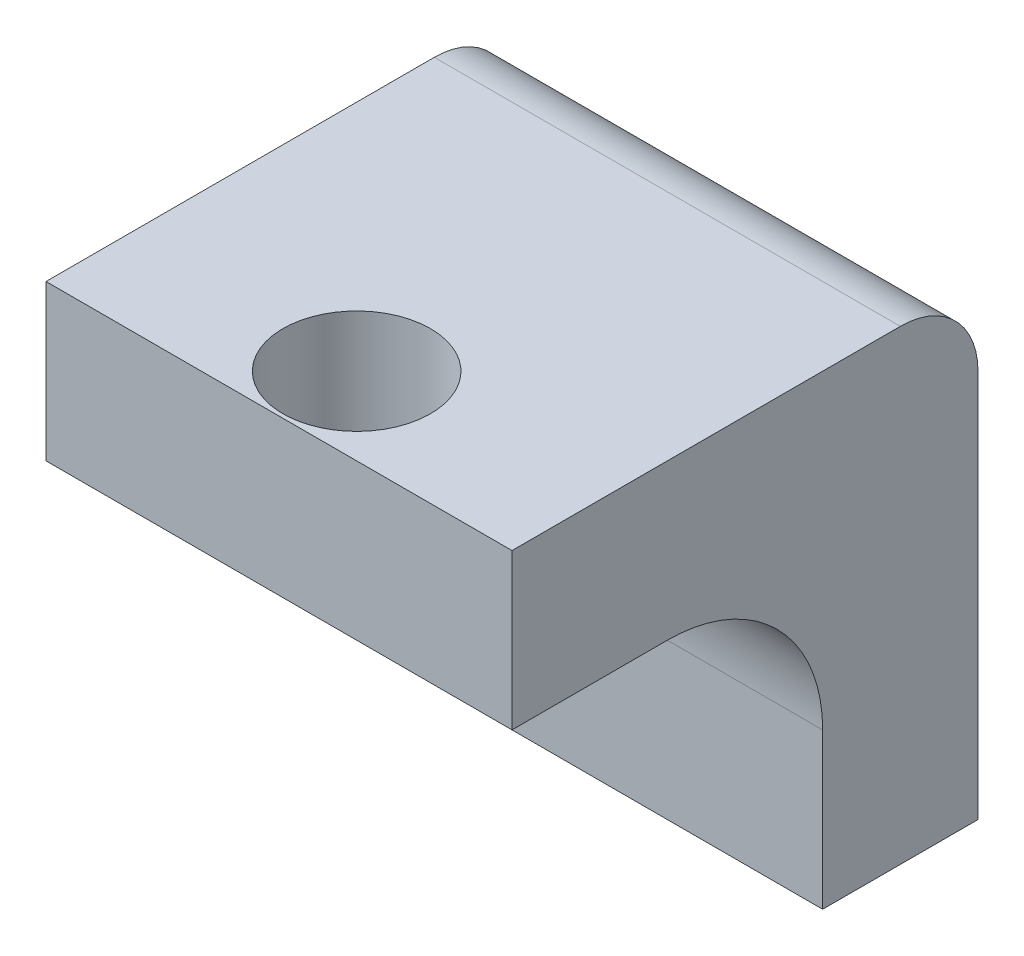
ISO-10303-21;
HEADER;
FILE_DESCRIPTION(('STEP AP214'),'2;1');
FILE_NAME('part.step','',(''),(''),'','','');
FILE_SCHEMA(('AUTOMOTIVE_DESIGN { 1 0 10303 214 1 1 1 1 }'));
ENDSEC;
DATA;
#1=APPLICATION_CONTEXT('core data for automotive mechanical design processes');
#2=APPLICATION_PROTOCOL_DEFINITION('international standard','automotive_design',2000,#1);
#3=PRODUCT_CONTEXT('',#1,'mechanical');
#4=PRODUCT('Part','Part','',(#3));
#5=PRODUCT_RELATED_PRODUCT_CATEGORY('part','',(#4));
#6=PRODUCT_DEFINITION_FORMATION('','',#4);
#7=PRODUCT_DEFINITION_CONTEXT('part definition',#1,'design');
#8=PRODUCT_DEFINITION('design','',#6,#7);
#9=PRODUCT_DEFINITION_SHAPE('','',#8);
#10=(LENGTH_UNIT() NAMED_UNIT(*) SI_UNIT(.MILLI.,.METRE.));
#11=(NAMED_UNIT(*) PLANE_ANGLE_UNIT() SI_UNIT($,.RADIAN.));
#12=(NAMED_UNIT(*) SI_UNIT($,.STERADIAN.) SOLID_ANGLE_UNIT());
#13=UNCERTAINTY_MEASURE_WITH_UNIT(LENGTH_MEASURE(1.E-05),#10,'distance_accuracy_value','');
#14=(GEOMETRIC_REPRESENTATION_CONTEXT(3) GLOBAL_UNCERTAINTY_ASSIGNED_CONTEXT((#13)) GLOBAL_UNIT_ASSIGNED_CONTEXT((#10,
#11,#12)) REPRESENTATION_CONTEXT('',''));
#15=CARTESIAN_POINT('',(0.,0.,0.));
#16=DIRECTION('',(0.,0.,1.));
#17=DIRECTION('',(1.,0.,0.));
#18=AXIS2_PLACEMENT_3D('',#15,#16,#17);
#19=CARTESIAN_POINT('',(0.,0.,10.));
#20=DIRECTION('',(1.,0.,0.));
#21=DIRECTION('',(0.,0.,-1.));
#22=AXIS2_PLACEMENT_3D('',#19,#20,#21);
#23=PLANE('',#22);
#24=DIRECTION('',(0.,0.,-1.));
#25=VECTOR('',#24,1.);
#26=CARTESIAN_POINT('',(0.,30.,10.));
#27=LINE('',#26,#25);
#28=CARTESIAN_POINT('',(0.,30.,30.));
#29=VERTEX_POINT('',#28);
#30=CARTESIAN_POINT('',(0.,30.,5.));
#31=VERTEX_POINT('',#30);
#32=EDGE_CURVE('E121',#29,#31,#27,.T.);
#33=ORIENTED_EDGE('',*,*,#32,.T.);
#34=CARTESIAN_POINT('',(0.,25.,5.));
#35=DIRECTION('',(1.,0.,0.));
#36=DIRECTION('',(0.,0.,-1.));
#37=AXIS2_PLACEMENT_3D('',#34,#35,#36);
#38=CIRCLE('',#37,5.);
#39=CARTESIAN_POINT('',(0.,25.,0.));
#40=VERTEX_POINT('',#39);
#41=EDGE_CURVE('E68',#31,#40,#38,.F.);
#42=ORIENTED_EDGE('',*,*,#41,.T.);
#43=DIRECTION('',(0.,-1.,0.));
#44=VECTOR('',#43,1.);
#45=CARTESIAN_POINT('',(0.,0.,0.));
#46=LINE('',#45,#44);
#47=CARTESIAN_POINT('',(0.,0.,0.));
#48=VERTEX_POINT('',#47);
#49=EDGE_CURVE('E128',#40,#48,#46,.T.);
#50=ORIENTED_EDGE('',*,*,#49,.T.);
#51=DIRECTION('',(0.,0.,-1.));
#52=VECTOR('',#51,1.);
#53=CARTESIAN_POINT('',(0.,0.,10.));
#54=LINE('',#53,#52);
#55=CARTESIAN_POINT('',(0.,0.,10.));
#56=VERTEX_POINT('',#55);
#57=EDGE_CURVE('E161',#56,#48,#54,.T.);
#58=ORIENTED_EDGE('',*,*,#57,.F.);
#59=DIRECTION('',(0.,-1.,0.));
#60=VECTOR('',#59,1.);
#61=CARTESIAN_POINT('',(0.,0.,10.));
#62=LINE('',#61,#60);
#63=CARTESIAN_POINT('',(0.,10.,10.));
#64=VERTEX_POINT('',#63);
#65=EDGE_CURVE('E146',#64,#56,#62,.T.);
#66=ORIENTED_EDGE('',*,*,#65,.F.);
#67=CARTESIAN_POINT('',(0.,10.,20.));
#68=DIRECTION('',(1.,0.,0.));
#69=DIRECTION('',(0.,0.,-1.));
#70=AXIS2_PLACEMENT_3D('',#67,#68,#69);
#71=CIRCLE('',#70,10.);
#72=CARTESIAN_POINT('',(0.,20.,20.));
#73=VERTEX_POINT('',#72);
#74=EDGE_CURVE('E169',#64,#73,#71,.T.);
#75=ORIENTED_EDGE('',*,*,#74,.T.);
#76=DIRECTION('',(0.,0.,-1.));
#77=VECTOR('',#76,1.);
#78=CARTESIAN_POINT('',(0.,20.,30.));
#79=LINE('',#78,#77);
#80=CARTESIAN_POINT('',(0.,20.,30.));
#81=VERTEX_POINT('',#80);
#82=EDGE_CURVE('E141',#81,#73,#79,.T.);
#83=ORIENTED_EDGE('',*,*,#82,.F.);
#84=DIRECTION('',(0.,-1.,0.));
#85=VECTOR('',#84,1.);
#86=CARTESIAN_POINT('',(0.,30.,30.));
#87=LINE('',#86,#85);
#88=EDGE_CURVE('E137',#29,#81,#87,.T.);
#89=ORIENTED_EDGE('',*,*,#88,.F.);
#90=EDGE_LOOP('',(#33,#42,#50,#58,#66,#75,#83,#89));
#91=FACE_BOUND('',#90,.T.);
#92=ADVANCED_FACE('F46',(#91),#23,.F.);
#93=CARTESIAN_POINT('',(0.,0.,10.));
#94=DIRECTION('',(0.,1.,0.));
#95=DIRECTION('',(0.,0.,1.));
#96=AXIS2_PLACEMENT_3D('',#93,#94,#95);
#97=PLANE('',#96);
#98=DIRECTION('',(1.,0.,0.));
#99=VECTOR('',#98,1.);
#100=CARTESIAN_POINT('',(0.,0.,0.));
#101=LINE('',#100,#99);
#102=CARTESIAN_POINT('',(30.,0.,0.));
#103=VERTEX_POINT('',#102);
#104=EDGE_CURVE('E155',#48,#103,#101,.T.);
#105=ORIENTED_EDGE('',*,*,#104,.T.);
#106=DIRECTION('',(0.,0.,-1.));
#107=VECTOR('',#106,1.);
#108=CARTESIAN_POINT('',(30.,0.,10.));
#109=LINE('',#108,#107);
#110=CARTESIAN_POINT('',(30.,0.,10.));
#111=VERTEX_POINT('',#110);
#112=EDGE_CURVE('E120',#111,#103,#109,.T.);
#113=ORIENTED_EDGE('',*,*,#112,.F.);
#114=DIRECTION('',(1.,0.,0.));
#115=VECTOR('',#114,1.);
#116=CARTESIAN_POINT('',(0.,0.,10.));
#117=LINE('',#116,#115);
#118=EDGE_CURVE('E148',#56,#111,#117,.T.);
#119=ORIENTED_EDGE('',*,*,#118,.F.);
#120=ORIENTED_EDGE('',*,*,#57,.T.);
#121=EDGE_LOOP('',(#105,#113,#119,#120));
#122=FACE_BOUND('',#121,.T.);
#123=ADVANCED_FACE('F192',(#122),#97,.F.);
#124=CARTESIAN_POINT('',(30.,0.,10.));
#125=DIRECTION('',(-1.,0.,0.));
#126=DIRECTION('',(0.,0.,1.));
#127=AXIS2_PLACEMENT_3D('',#124,#125,#126);
#128=PLANE('',#127);
#129=DIRECTION('',(0.,1.,0.));
#130=VECTOR('',#129,1.);
#131=CARTESIAN_POINT('',(30.,0.,0.));
#132=LINE('',#131,#130);
#133=CARTESIAN_POINT('',(30.,25.,0.));
#134=VERTEX_POINT('',#133);
#135=EDGE_CURVE('E149',#103,#134,#132,.T.);
#136=ORIENTED_EDGE('',*,*,#135,.T.);
#137=CARTESIAN_POINT('',(30.,25.,5.));
#138=DIRECTION('',(-1.,0.,0.));
#139=DIRECTION('',(0.,0.,1.));
#140=AXIS2_PLACEMENT_3D('',#137,#138,#139);
#141=CIRCLE('',#140,5.);
#142=CARTESIAN_POINT('',(30.,30.,5.));
#143=VERTEX_POINT('',#142);
#144=EDGE_CURVE('E12',#134,#143,#141,.F.);
#145=ORIENTED_EDGE('',*,*,#144,.T.);
#146=DIRECTION('',(0.,0.,-1.));
#147=VECTOR('',#146,1.);
#148=CARTESIAN_POINT('',(30.,30.,10.));
#149=LINE('',#148,#147);
#150=CARTESIAN_POINT('',(30.,30.,30.));
#151=VERTEX_POINT('',#150);
#152=EDGE_CURVE('E109',#151,#143,#149,.T.);
#153=ORIENTED_EDGE('',*,*,#152,.F.);
#154=DIRECTION('',(0.,-1.,0.));
#155=VECTOR('',#154,1.);
#156=CARTESIAN_POINT('',(30.,30.,30.));
#157=LINE('',#156,#155);
#158=CARTESIAN_POINT('',(30.,20.,30.));
#159=VERTEX_POINT('',#158);
#160=EDGE_CURVE('E114',#151,#159,#157,.T.);
#161=ORIENTED_EDGE('',*,*,#160,.T.);
#162=DIRECTION('',(0.,0.,-1.));
#163=VECTOR('',#162,1.);
#164=CARTESIAN_POINT('',(30.,20.,30.));
#165=LINE('',#164,#163);
#166=CARTESIAN_POINT('',(30.,20.,20.));
#167=VERTEX_POINT('',#166);
#168=EDGE_CURVE('E134',#159,#167,#165,.T.);
#169=ORIENTED_EDGE('',*,*,#168,.T.);
#170=CARTESIAN_POINT('',(30.,10.,20.));
#171=DIRECTION('',(-1.,0.,0.));
#172=DIRECTION('',(0.,0.,1.));
#173=AXIS2_PLACEMENT_3D('',#170,#171,#172);
#174=CIRCLE('',#173,10.);
#175=CARTESIAN_POINT('',(30.,10.,10.));
#176=VERTEX_POINT('',#175);
#177=EDGE_CURVE('E171',#167,#176,#174,.T.);
#178=ORIENTED_EDGE('',*,*,#177,.T.);
#179=DIRECTION('',(0.,1.,0.));
#180=VECTOR('',#179,1.);
#181=CARTESIAN_POINT('',(30.,0.,10.));
#182=LINE('',#181,#180);
#183=EDGE_CURVE('E151',#111,#176,#182,.T.);
#184=ORIENTED_EDGE('',*,*,#183,.F.);
#185=ORIENTED_EDGE('',*,*,#112,.T.);
#186=EDGE_LOOP('',(#136,#145,#153,#161,#169,#178,#184,#185));
#187=FACE_BOUND('',#186,.T.);
#188=ADVANCED_FACE('F111',(#187),#128,.F.);
#189=CARTESIAN_POINT('',(0.,30.,10.));
#190=DIRECTION('',(0.,-1.,0.));
#191=DIRECTION('',(0.,0.,-1.));
#192=AXIS2_PLACEMENT_3D('',#189,#190,#191);
#193=PLANE('',#192);
#194=CARTESIAN_POINT('',(15.,30.,25.));
#195=DIRECTION('',(0.,-1.,0.));
#196=DIRECTION('',(0.,0.,-1.));
#197=AXIS2_PLACEMENT_3D('',#194,#195,#196);
#198=CIRCLE('',#197,4.75);
#199=CARTESIAN_POINT('',(15.,30.,20.25));
#200=VERTEX_POINT('',#199);
#201=EDGE_CURVE('E144',#200,#200,#198,.T.);
#202=ORIENTED_EDGE('',*,*,#201,.T.);
#203=EDGE_LOOP('',(#202));
#204=FACE_BOUND('',#203,.T.);
#205=ORIENTED_EDGE('',*,*,#152,.T.);
#206=DIRECTION('',(-1.,0.,0.));
#207=VECTOR('',#206,1.);
#208=CARTESIAN_POINT('',(0.,30.,5.));
#209=LINE('',#208,#207);
#210=EDGE_CURVE('E173',#143,#31,#209,.T.);
#211=ORIENTED_EDGE('',*,*,#210,.T.);
#212=ORIENTED_EDGE('',*,*,#32,.F.);
#213=DIRECTION('',(-1.,0.,0.));
#214=VECTOR('',#213,1.);
#215=CARTESIAN_POINT('',(30.,30.,30.));
#216=LINE('',#215,#214);
#217=EDGE_CURVE('E124',#151,#29,#216,.T.);
#218=ORIENTED_EDGE('',*,*,#217,.F.);
#219=EDGE_LOOP('',(#205,#211,#212,#218));
#220=FACE_BOUND('',#219,.T.);
#221=ADVANCED_FACE('F125',(#204,#220),#193,.F.);
#222=CARTESIAN_POINT('',(0.,0.,10.));
#223=DIRECTION('',(0.,0.,-1.));
#224=DIRECTION('',(-1.,0.,0.));
#225=AXIS2_PLACEMENT_3D('',#222,#223,#224);
#226=PLANE('',#225);
#227=ORIENTED_EDGE('',*,*,#183,.T.);
#228=DIRECTION('',(-1.,0.,0.));
#229=VECTOR('',#228,1.);
#230=CARTESIAN_POINT('',(0.,10.,10.));
#231=LINE('',#230,#229);
#232=EDGE_CURVE('E164',#176,#64,#231,.T.);
#233=ORIENTED_EDGE('',*,*,#232,.T.);
#234=ORIENTED_EDGE('',*,*,#65,.T.);
#235=ORIENTED_EDGE('',*,*,#118,.T.);
#236=EDGE_LOOP('',(#227,#233,#234,#235));
#237=FACE_BOUND('',#236,.T.);
#238=ADVANCED_FACE('F187',(#237),#226,.F.);
#239=CARTESIAN_POINT('',(0.,0.,0.));
#240=DIRECTION('',(0.,0.,-1.));
#241=DIRECTION('',(-1.,0.,0.));
#242=AXIS2_PLACEMENT_3D('',#239,#240,#241);
#243=PLANE('',#242);
#244=ORIENTED_EDGE('',*,*,#49,.F.);
#245=DIRECTION('',(-1.,0.,0.));
#246=VECTOR('',#245,1.);
#247=CARTESIAN_POINT('',(30.,25.,0.));
#248=LINE('',#247,#246);
#249=EDGE_CURVE('E54',#40,#134,#248,.F.);
#250=ORIENTED_EDGE('',*,*,#249,.T.);
#251=ORIENTED_EDGE('',*,*,#135,.F.);
#252=ORIENTED_EDGE('',*,*,#104,.F.);
#253=EDGE_LOOP('',(#244,#250,#251,#252));
#254=FACE_BOUND('',#253,.T.);
#255=ADVANCED_FACE('F194',(#254),#243,.T.);
#256=CARTESIAN_POINT('',(30.,20.,30.));
#257=DIRECTION('',(0.,1.,0.));
#258=DIRECTION('',(0.,0.,1.));
#259=AXIS2_PLACEMENT_3D('',#256,#257,#258);
#260=PLANE('',#259);
#261=CARTESIAN_POINT('',(15.,20.,25.));
#262=DIRECTION('',(0.,-1.,0.));
#263=DIRECTION('',(0.,0.,-1.));
#264=AXIS2_PLACEMENT_3D('',#261,#262,#263);
#265=CIRCLE('',#264,4.75);
#266=CARTESIAN_POINT('',(15.,20.,20.25));
#267=VERTEX_POINT('',#266);
#268=EDGE_CURVE('E324',#267,#267,#265,.T.);
#269=ORIENTED_EDGE('',*,*,#268,.F.);
#270=EDGE_LOOP('',(#269));
#271=FACE_BOUND('',#270,.T.);
#272=ORIENTED_EDGE('',*,*,#82,.T.);
#273=DIRECTION('',(-1.,0.,0.));
#274=VECTOR('',#273,1.);
#275=CARTESIAN_POINT('',(30.,20.,20.));
#276=LINE('',#275,#274);
#277=EDGE_CURVE('E167',#73,#167,#276,.F.);
#278=ORIENTED_EDGE('',*,*,#277,.T.);
#279=ORIENTED_EDGE('',*,*,#168,.F.);
#280=DIRECTION('',(-1.,0.,0.));
#281=VECTOR('',#280,1.);
#282=CARTESIAN_POINT('',(30.,20.,30.));
#283=LINE('',#282,#281);
#284=EDGE_CURVE('E129',#159,#81,#283,.T.);
#285=ORIENTED_EDGE('',*,*,#284,.T.);
#286=EDGE_LOOP('',(#272,#278,#279,#285));
#287=FACE_BOUND('',#286,.T.);
#288=ADVANCED_FACE('F178',(#271,#287),#260,.F.);
#289=CARTESIAN_POINT('',(30.,30.,30.));
#290=DIRECTION('',(0.,0.,-1.));
#291=DIRECTION('',(-1.,0.,0.));
#292=AXIS2_PLACEMENT_3D('',#289,#290,#291);
#293=PLANE('',#292);
#294=ORIENTED_EDGE('',*,*,#88,.T.);
#295=ORIENTED_EDGE('',*,*,#284,.F.);
#296=ORIENTED_EDGE('',*,*,#160,.F.);
#297=ORIENTED_EDGE('',*,*,#217,.T.);
#298=EDGE_LOOP('',(#294,#295,#296,#297));
#299=FACE_BOUND('',#298,.T.);
#300=ADVANCED_FACE('F131',(#299),#293,.F.);
#301=CARTESIAN_POINT('',(0.,10.,20.));
#302=DIRECTION('',(1.,0.,0.));
#303=DIRECTION('',(0.,0.,-1.));
#304=AXIS2_PLACEMENT_3D('',#301,#302,#303);
#305=CYLINDRICAL_SURFACE('',#304,10.);
#306=ORIENTED_EDGE('',*,*,#177,.F.);
#307=ORIENTED_EDGE('',*,*,#277,.F.);
#308=ORIENTED_EDGE('',*,*,#74,.F.);
#309=ORIENTED_EDGE('',*,*,#232,.F.);
#310=EDGE_LOOP('',(#306,#307,#308,#309));
#311=FACE_BOUND('',#310,.T.);
#312=ADVANCED_FACE('F184',(#311),#305,.F.);
#313=CARTESIAN_POINT('',(15.,30.,25.));
#314=DIRECTION('',(0.,-1.,0.));
#315=DIRECTION('',(0.,0.,-1.));
#316=AXIS2_PLACEMENT_3D('',#313,#314,#315);
#317=CYLINDRICAL_SURFACE('',#316,4.75);
#318=ORIENTED_EDGE('',*,*,#201,.F.);
#319=EDGE_LOOP('',(#318));
#320=FACE_BOUND('',#319,.T.);
#321=ORIENTED_EDGE('',*,*,#268,.T.);
#322=EDGE_LOOP('',(#321));
#323=FACE_BOUND('',#322,.T.);
#324=ADVANCED_FACE('F196',(#320,#323),#317,.F.);
#325=CARTESIAN_POINT('',(0.,25.,5.));
#326=DIRECTION('',(1.,0.,0.));
#327=DIRECTION('',(0.,0.,-1.));
#328=AXIS2_PLACEMENT_3D('',#325,#326,#327);
#329=CYLINDRICAL_SURFACE('',#328,5.);
#330=ORIENTED_EDGE('',*,*,#144,.F.);
#331=ORIENTED_EDGE('',*,*,#249,.F.);
#332=ORIENTED_EDGE('',*,*,#41,.F.);
#333=ORIENTED_EDGE('',*,*,#210,.F.);
#334=EDGE_LOOP('',(#330,#331,#332,#333));
#335=FACE_BOUND('',#334,.T.);
#336=ADVANCED_FACE('F48',(#335),#329,.T.);
#337=CLOSED_SHELL('',(#92,#123,#188,#221,#238,#255,#288,#300,#312,#324,#336));
#338=MANIFOLD_SOLID_BREP('B2',#337);
#339=ADVANCED_BREP_SHAPE_REPRESENTATION('',(#18,#338),#14);
#340=SHAPE_DEFINITION_REPRESENTATION(#9,#339);
ENDSEC;
END-ISO-10303-21;
